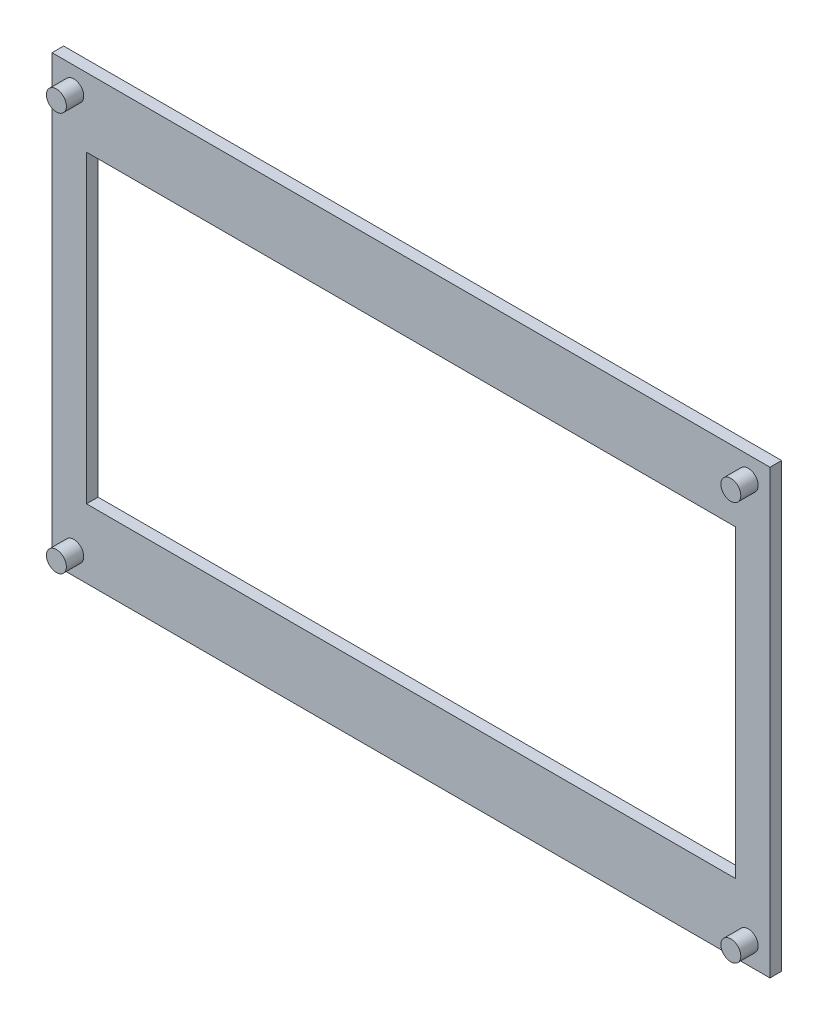
ISO-10303-21;
HEADER;
FILE_DESCRIPTION(('STEP AP214'),'2;1');
FILE_NAME('part.step','',(''),(''),'','','');
FILE_SCHEMA(('AUTOMOTIVE_DESIGN { 1 0 10303 214 1 1 1 1 }'));
ENDSEC;
DATA;
#1=APPLICATION_CONTEXT('core data for automotive mechanical design processes');
#2=APPLICATION_PROTOCOL_DEFINITION('international standard','automotive_design',2000,#1);
#3=PRODUCT_CONTEXT('',#1,'mechanical');
#4=PRODUCT('Part','Part','',(#3));
#5=PRODUCT_RELATED_PRODUCT_CATEGORY('part','',(#4));
#6=PRODUCT_DEFINITION_FORMATION('','',#4);
#7=PRODUCT_DEFINITION_CONTEXT('part definition',#1,'design');
#8=PRODUCT_DEFINITION('design','',#6,#7);
#9=PRODUCT_DEFINITION_SHAPE('','',#8);
#10=(LENGTH_UNIT() NAMED_UNIT(*) SI_UNIT(.MILLI.,.METRE.));
#11=(NAMED_UNIT(*) PLANE_ANGLE_UNIT() SI_UNIT($,.RADIAN.));
#12=(NAMED_UNIT(*) SI_UNIT($,.STERADIAN.) SOLID_ANGLE_UNIT());
#13=UNCERTAINTY_MEASURE_WITH_UNIT(LENGTH_MEASURE(1.E-05),#10,'distance_accuracy_value','');
#14=(GEOMETRIC_REPRESENTATION_CONTEXT(3) GLOBAL_UNCERTAINTY_ASSIGNED_CONTEXT((#13)) GLOBAL_UNIT_ASSIGNED_CONTEXT((#10,
#11,#12)) REPRESENTATION_CONTEXT('',''));
#15=CARTESIAN_POINT('',(0.,0.,0.));
#16=DIRECTION('',(0.,0.,1.));
#17=DIRECTION('',(1.,0.,0.));
#18=AXIS2_PLACEMENT_3D('',#15,#16,#17);
#19=CARTESIAN_POINT('',(0.,0.,-1.6));
#20=DIRECTION('',(-1.,0.,0.));
#21=DIRECTION('',(0.,0.,1.));
#22=AXIS2_PLACEMENT_3D('',#19,#20,#21);
#23=PLANE('',#22);
#24=DIRECTION('',(0.,-1.,0.));
#25=VECTOR('',#24,1.);
#26=CARTESIAN_POINT('',(0.,0.,0.));
#27=LINE('',#26,#25);
#28=CARTESIAN_POINT('',(0.,61.,0.));
#29=VERTEX_POINT('',#28);
#30=CARTESIAN_POINT('',(0.,0.,0.));
#31=VERTEX_POINT('',#30);
#32=EDGE_CURVE('E133',#29,#31,#27,.T.);
#33=ORIENTED_EDGE('',*,*,#32,.F.);
#34=DIRECTION('',(0.,0.,1.));
#35=VECTOR('',#34,1.);
#36=CARTESIAN_POINT('',(0.,61.,-1.6));
#37=LINE('',#36,#35);
#38=CARTESIAN_POINT('',(0.,61.,-1.6));
#39=VERTEX_POINT('',#38);
#40=EDGE_CURVE('E161',#39,#29,#37,.T.);
#41=ORIENTED_EDGE('',*,*,#40,.F.);
#42=DIRECTION('',(0.,-1.,0.));
#43=VECTOR('',#42,1.);
#44=CARTESIAN_POINT('',(0.,0.,-1.6));
#45=LINE('',#44,#43);
#46=CARTESIAN_POINT('',(0.,0.,-1.6));
#47=VERTEX_POINT('',#46);
#48=EDGE_CURVE('E137',#39,#47,#45,.T.);
#49=ORIENTED_EDGE('',*,*,#48,.T.);
#50=DIRECTION('',(0.,0.,1.));
#51=VECTOR('',#50,1.);
#52=CARTESIAN_POINT('',(0.,0.,-1.6));
#53=LINE('',#52,#51);
#54=EDGE_CURVE('E150',#47,#31,#53,.T.);
#55=ORIENTED_EDGE('',*,*,#54,.T.);
#56=EDGE_LOOP('',(#33,#41,#49,#55));
#57=FACE_BOUND('',#56,.T.);
#58=ADVANCED_FACE('F33',(#57),#23,.T.);
#59=CARTESIAN_POINT('',(0.,61.,-1.6));
#60=DIRECTION('',(0.,1.,0.));
#61=DIRECTION('',(0.,0.,1.));
#62=AXIS2_PLACEMENT_3D('',#59,#60,#61);
#63=PLANE('',#62);
#64=DIRECTION('',(-1.,0.,0.));
#65=VECTOR('',#64,1.);
#66=CARTESIAN_POINT('',(0.,61.,0.));
#67=LINE('',#66,#65);
#68=CARTESIAN_POINT('',(99.,61.,0.));
#69=VERTEX_POINT('',#68);
#70=EDGE_CURVE('E141',#69,#29,#67,.T.);
#71=ORIENTED_EDGE('',*,*,#70,.F.);
#72=DIRECTION('',(0.,0.,1.));
#73=VECTOR('',#72,1.);
#74=CARTESIAN_POINT('',(99.,61.,-1.6));
#75=LINE('',#74,#73);
#76=CARTESIAN_POINT('',(99.,61.,-1.6));
#77=VERTEX_POINT('',#76);
#78=EDGE_CURVE('E164',#77,#69,#75,.T.);
#79=ORIENTED_EDGE('',*,*,#78,.F.);
#80=DIRECTION('',(-1.,0.,0.));
#81=VECTOR('',#80,1.);
#82=CARTESIAN_POINT('',(0.,61.,-1.6));
#83=LINE('',#82,#81);
#84=EDGE_CURVE('E147',#77,#39,#83,.T.);
#85=ORIENTED_EDGE('',*,*,#84,.T.);
#86=ORIENTED_EDGE('',*,*,#40,.T.);
#87=EDGE_LOOP('',(#71,#79,#85,#86));
#88=FACE_BOUND('',#87,.T.);
#89=ADVANCED_FACE('F202',(#88),#63,.T.);
#90=CARTESIAN_POINT('',(99.,0.,-1.6));
#91=DIRECTION('',(1.,0.,0.));
#92=DIRECTION('',(0.,0.,-1.));
#93=AXIS2_PLACEMENT_3D('',#90,#91,#92);
#94=PLANE('',#93);
#95=DIRECTION('',(0.,1.,0.));
#96=VECTOR('',#95,1.);
#97=CARTESIAN_POINT('',(99.,0.,0.));
#98=LINE('',#97,#96);
#99=CARTESIAN_POINT('',(99.,0.,0.));
#100=VERTEX_POINT('',#99);
#101=EDGE_CURVE('E156',#100,#69,#98,.T.);
#102=ORIENTED_EDGE('',*,*,#101,.F.);
#103=DIRECTION('',(0.,0.,1.));
#104=VECTOR('',#103,1.);
#105=CARTESIAN_POINT('',(99.,0.,-1.6));
#106=LINE('',#105,#104);
#107=CARTESIAN_POINT('',(99.,0.,-1.6));
#108=VERTEX_POINT('',#107);
#109=EDGE_CURVE('E166',#108,#100,#106,.T.);
#110=ORIENTED_EDGE('',*,*,#109,.F.);
#111=DIRECTION('',(0.,1.,0.));
#112=VECTOR('',#111,1.);
#113=CARTESIAN_POINT('',(99.,0.,-1.6));
#114=LINE('',#113,#112);
#115=EDGE_CURVE('E144',#108,#77,#114,.T.);
#116=ORIENTED_EDGE('',*,*,#115,.T.);
#117=ORIENTED_EDGE('',*,*,#78,.T.);
#118=EDGE_LOOP('',(#102,#110,#116,#117));
#119=FACE_BOUND('',#118,.T.);
#120=ADVANCED_FACE('F200',(#119),#94,.T.);
#121=CARTESIAN_POINT('',(0.,0.,-1.6));
#122=DIRECTION('',(0.,-1.,0.));
#123=DIRECTION('',(0.,0.,-1.));
#124=AXIS2_PLACEMENT_3D('',#121,#122,#123);
#125=PLANE('',#124);
#126=DIRECTION('',(1.,0.,0.));
#127=VECTOR('',#126,1.);
#128=CARTESIAN_POINT('',(0.,0.,0.));
#129=LINE('',#128,#127);
#130=EDGE_CURVE('E153',#31,#100,#129,.T.);
#131=ORIENTED_EDGE('',*,*,#130,.F.);
#132=ORIENTED_EDGE('',*,*,#54,.F.);
#133=DIRECTION('',(1.,0.,0.));
#134=VECTOR('',#133,1.);
#135=CARTESIAN_POINT('',(0.,0.,-1.6));
#136=LINE('',#135,#134);
#137=EDGE_CURVE('E140',#47,#108,#136,.T.);
#138=ORIENTED_EDGE('',*,*,#137,.T.);
#139=ORIENTED_EDGE('',*,*,#109,.T.);
#140=EDGE_LOOP('',(#131,#132,#138,#139));
#141=FACE_BOUND('',#140,.T.);
#142=ADVANCED_FACE('F196',(#141),#125,.T.);
#143=CARTESIAN_POINT('',(0.,0.,-1.6));
#144=DIRECTION('',(0.,0.,-1.));
#145=DIRECTION('',(-1.,0.,0.));
#146=AXIS2_PLACEMENT_3D('',#143,#144,#145);
#147=PLANE('',#146);
#148=DIRECTION('',(0.,-1.,0.));
#149=VECTOR('',#148,1.);
#150=CARTESIAN_POINT('',(4.75000000000002,51.5,-1.6));
#151=LINE('',#150,#149);
#152=CARTESIAN_POINT('',(4.75000000000002,51.5,-1.6));
#153=VERTEX_POINT('',#152);
#154=CARTESIAN_POINT('',(4.75000000000001,9.50000000000001,-1.6));
#155=VERTEX_POINT('',#154);
#156=EDGE_CURVE('E99',#153,#155,#151,.T.);
#157=ORIENTED_EDGE('',*,*,#156,.T.);
#158=DIRECTION('',(1.,0.,0.));
#159=VECTOR('',#158,1.);
#160=CARTESIAN_POINT('',(4.75000000000001,9.50000000000001,-1.6));
#161=LINE('',#160,#159);
#162=CARTESIAN_POINT('',(94.25,9.50000000000001,-1.6));
#163=VERTEX_POINT('',#162);
#164=EDGE_CURVE('E108',#155,#163,#161,.T.);
#165=ORIENTED_EDGE('',*,*,#164,.T.);
#166=DIRECTION('',(0.,1.,0.));
#167=VECTOR('',#166,1.);
#168=CARTESIAN_POINT('',(94.25,51.5,-1.6));
#169=LINE('',#168,#167);
#170=CARTESIAN_POINT('',(94.25,51.5,-1.6));
#171=VERTEX_POINT('',#170);
#172=EDGE_CURVE('E47',#163,#171,#169,.T.);
#173=ORIENTED_EDGE('',*,*,#172,.T.);
#174=DIRECTION('',(-1.,0.,0.));
#175=VECTOR('',#174,1.);
#176=CARTESIAN_POINT('',(4.75000000000002,51.5,-1.6));
#177=LINE('',#176,#175);
#178=EDGE_CURVE('E105',#171,#153,#177,.T.);
#179=ORIENTED_EDGE('',*,*,#178,.T.);
#180=EDGE_LOOP('',(#157,#165,#173,#179));
#181=FACE_BOUND('',#180,.T.);
#182=ORIENTED_EDGE('',*,*,#48,.F.);
#183=ORIENTED_EDGE('',*,*,#84,.F.);
#184=ORIENTED_EDGE('',*,*,#115,.F.);
#185=ORIENTED_EDGE('',*,*,#137,.F.);
#186=EDGE_LOOP('',(#182,#183,#184,#185));
#187=FACE_BOUND('',#186,.T.);
#188=ADVANCED_FACE('F112',(#181,#187),#147,.T.);
#189=CARTESIAN_POINT('',(0.,0.,0.));
#190=DIRECTION('',(0.,0.,-1.));
#191=DIRECTION('',(-1.,0.,0.));
#192=AXIS2_PLACEMENT_3D('',#189,#190,#191);
#193=PLANE('',#192);
#194=CARTESIAN_POINT('',(3.,3.00000000000001,0.));
#195=DIRECTION('',(0.,0.,-1.));
#196=DIRECTION('',(-1.,0.,0.));
#197=AXIS2_PLACEMENT_3D('',#194,#195,#196);
#198=CIRCLE('',#197,1.375);
#199=CARTESIAN_POINT('',(1.625,3.00000000000001,0.));
#200=VERTEX_POINT('',#199);
#201=EDGE_CURVE('E11',#200,#200,#198,.F.);
#202=ORIENTED_EDGE('',*,*,#201,.F.);
#203=EDGE_LOOP('',(#202));
#204=FACE_BOUND('',#203,.T.);
#205=CARTESIAN_POINT('',(96.,3.,0.));
#206=DIRECTION('',(0.,0.,-1.));
#207=DIRECTION('',(-1.,0.,0.));
#208=AXIS2_PLACEMENT_3D('',#205,#206,#207);
#209=CIRCLE('',#208,1.375);
#210=CARTESIAN_POINT('',(94.625,3.,0.));
#211=VERTEX_POINT('',#210);
#212=EDGE_CURVE('E40',#211,#211,#209,.F.);
#213=ORIENTED_EDGE('',*,*,#212,.F.);
#214=EDGE_LOOP('',(#213));
#215=FACE_BOUND('',#214,.T.);
#216=CARTESIAN_POINT('',(96.,58.,0.));
#217=DIRECTION('',(0.,0.,-1.));
#218=DIRECTION('',(-1.,0.,0.));
#219=AXIS2_PLACEMENT_3D('',#216,#217,#218);
#220=CIRCLE('',#219,1.375);
#221=CARTESIAN_POINT('',(94.625,58.,0.));
#222=VERTEX_POINT('',#221);
#223=EDGE_CURVE('E171',#222,#222,#220,.F.);
#224=ORIENTED_EDGE('',*,*,#223,.F.);
#225=EDGE_LOOP('',(#224));
#226=FACE_BOUND('',#225,.T.);
#227=CARTESIAN_POINT('',(3.,58.,0.));
#228=DIRECTION('',(0.,0.,-1.));
#229=DIRECTION('',(-1.,0.,0.));
#230=AXIS2_PLACEMENT_3D('',#227,#228,#229);
#231=CIRCLE('',#230,1.375);
#232=CARTESIAN_POINT('',(1.625,58.,0.));
#233=VERTEX_POINT('',#232);
#234=EDGE_CURVE('E163',#233,#233,#231,.F.);
#235=ORIENTED_EDGE('',*,*,#234,.F.);
#236=EDGE_LOOP('',(#235));
#237=FACE_BOUND('',#236,.T.);
#238=DIRECTION('',(1.,0.,0.));
#239=VECTOR('',#238,1.);
#240=CARTESIAN_POINT('',(4.75000000000001,9.50000000000001,0.));
#241=LINE('',#240,#239);
#242=CARTESIAN_POINT('',(4.75000000000001,9.50000000000001,0.));
#243=VERTEX_POINT('',#242);
#244=CARTESIAN_POINT('',(94.25,9.50000000000001,0.));
#245=VERTEX_POINT('',#244);
#246=EDGE_CURVE('E127',#243,#245,#241,.T.);
#247=ORIENTED_EDGE('',*,*,#246,.F.);
#248=DIRECTION('',(0.,-1.,0.));
#249=VECTOR('',#248,1.);
#250=CARTESIAN_POINT('',(4.75000000000002,51.5,0.));
#251=LINE('',#250,#249);
#252=CARTESIAN_POINT('',(4.75000000000002,51.5,0.));
#253=VERTEX_POINT('',#252);
#254=EDGE_CURVE('E55',#253,#243,#251,.T.);
#255=ORIENTED_EDGE('',*,*,#254,.F.);
#256=DIRECTION('',(-1.,0.,0.));
#257=VECTOR('',#256,1.);
#258=CARTESIAN_POINT('',(4.75000000000002,51.5,0.));
#259=LINE('',#258,#257);
#260=CARTESIAN_POINT('',(94.25,51.5,0.));
#261=VERTEX_POINT('',#260);
#262=EDGE_CURVE('E115',#261,#253,#259,.T.);
#263=ORIENTED_EDGE('',*,*,#262,.F.);
#264=DIRECTION('',(0.,1.,0.));
#265=VECTOR('',#264,1.);
#266=CARTESIAN_POINT('',(94.25,51.5,0.));
#267=LINE('',#266,#265);
#268=EDGE_CURVE('E118',#245,#261,#267,.T.);
#269=ORIENTED_EDGE('',*,*,#268,.F.);
#270=EDGE_LOOP('',(#247,#255,#263,#269));
#271=FACE_BOUND('',#270,.T.);
#272=ORIENTED_EDGE('',*,*,#32,.T.);
#273=ORIENTED_EDGE('',*,*,#130,.T.);
#274=ORIENTED_EDGE('',*,*,#101,.T.);
#275=ORIENTED_EDGE('',*,*,#70,.T.);
#276=EDGE_LOOP('',(#272,#273,#274,#275));
#277=FACE_BOUND('',#276,.T.);
#278=ADVANCED_FACE('F178',(#204,#215,#226,#237,#271,#277),#193,.F.);
#279=CARTESIAN_POINT('',(4.75000000000002,51.5,-1.6));
#280=DIRECTION('',(-1.,0.,0.));
#281=DIRECTION('',(0.,-1.,0.));
#282=AXIS2_PLACEMENT_3D('',#279,#280,#281);
#283=PLANE('',#282);
#284=ORIENTED_EDGE('',*,*,#254,.T.);
#285=DIRECTION('',(0.,0.,1.));
#286=VECTOR('',#285,1.);
#287=CARTESIAN_POINT('',(4.75000000000001,9.50000000000001,-1.6));
#288=LINE('',#287,#286);
#289=EDGE_CURVE('E95',#155,#243,#288,.T.);
#290=ORIENTED_EDGE('',*,*,#289,.F.);
#291=ORIENTED_EDGE('',*,*,#156,.F.);
#292=DIRECTION('',(0.,0.,1.));
#293=VECTOR('',#292,1.);
#294=CARTESIAN_POINT('',(4.75000000000002,51.5,-1.6));
#295=LINE('',#294,#293);
#296=EDGE_CURVE('E131',#153,#253,#295,.T.);
#297=ORIENTED_EDGE('',*,*,#296,.T.);
#298=EDGE_LOOP('',(#284,#290,#291,#297));
#299=FACE_BOUND('',#298,.T.);
#300=ADVANCED_FACE('F97',(#299),#283,.F.);
#301=CARTESIAN_POINT('',(4.75000000000002,51.5,-1.6));
#302=DIRECTION('',(0.,1.,0.));
#303=DIRECTION('',(0.,0.,1.));
#304=AXIS2_PLACEMENT_3D('',#301,#302,#303);
#305=PLANE('',#304);
#306=ORIENTED_EDGE('',*,*,#262,.T.);
#307=ORIENTED_EDGE('',*,*,#296,.F.);
#308=ORIENTED_EDGE('',*,*,#178,.F.);
#309=DIRECTION('',(0.,0.,1.));
#310=VECTOR('',#309,1.);
#311=CARTESIAN_POINT('',(94.25,51.5,-1.6));
#312=LINE('',#311,#310);
#313=EDGE_CURVE('E134',#171,#261,#312,.T.);
#314=ORIENTED_EDGE('',*,*,#313,.T.);
#315=EDGE_LOOP('',(#306,#307,#308,#314));
#316=FACE_BOUND('',#315,.T.);
#317=ADVANCED_FACE('F240',(#316),#305,.F.);
#318=CARTESIAN_POINT('',(94.25,51.5,-1.6));
#319=DIRECTION('',(1.,0.,0.));
#320=DIRECTION('',(0.,1.,0.));
#321=AXIS2_PLACEMENT_3D('',#318,#319,#320);
#322=PLANE('',#321);
#323=ORIENTED_EDGE('',*,*,#268,.T.);
#324=ORIENTED_EDGE('',*,*,#313,.F.);
#325=ORIENTED_EDGE('',*,*,#172,.F.);
#326=DIRECTION('',(0.,0.,1.));
#327=VECTOR('',#326,1.);
#328=CARTESIAN_POINT('',(94.25,9.50000000000001,-1.6));
#329=LINE('',#328,#327);
#330=EDGE_CURVE('E104',#163,#245,#329,.T.);
#331=ORIENTED_EDGE('',*,*,#330,.T.);
#332=EDGE_LOOP('',(#323,#324,#325,#331));
#333=FACE_BOUND('',#332,.T.);
#334=ADVANCED_FACE('F248',(#333),#322,.F.);
#335=CARTESIAN_POINT('',(4.75000000000001,9.50000000000001,-1.6));
#336=DIRECTION('',(0.,-1.,0.));
#337=DIRECTION('',(0.,0.,-1.));
#338=AXIS2_PLACEMENT_3D('',#335,#336,#337);
#339=PLANE('',#338);
#340=ORIENTED_EDGE('',*,*,#246,.T.);
#341=ORIENTED_EDGE('',*,*,#330,.F.);
#342=ORIENTED_EDGE('',*,*,#164,.F.);
#343=ORIENTED_EDGE('',*,*,#289,.T.);
#344=EDGE_LOOP('',(#340,#341,#342,#343));
#345=FACE_BOUND('',#344,.T.);
#346=ADVANCED_FACE('F109',(#345),#339,.F.);
#347=CARTESIAN_POINT('',(3.,58.,2.4));
#348=DIRECTION('',(0.,0.,-1.));
#349=DIRECTION('',(-1.,0.,0.));
#350=AXIS2_PLACEMENT_3D('',#347,#348,#349);
#351=CYLINDRICAL_SURFACE('',#350,1.375);
#352=CARTESIAN_POINT('',(3.,58.,2.4));
#353=DIRECTION('',(0.,0.,1.));
#354=DIRECTION('',(1.,0.,0.));
#355=AXIS2_PLACEMENT_3D('',#352,#353,#354);
#356=CIRCLE('',#355,1.375);
#357=CARTESIAN_POINT('',(4.375,58.,2.4));
#358=VERTEX_POINT('',#357);
#359=EDGE_CURVE('E121',#358,#358,#356,.T.);
#360=ORIENTED_EDGE('',*,*,#359,.F.);
#361=EDGE_LOOP('',(#360));
#362=FACE_BOUND('',#361,.T.);
#363=ORIENTED_EDGE('',*,*,#234,.T.);
#364=EDGE_LOOP('',(#363));
#365=FACE_BOUND('',#364,.T.);
#366=ADVANCED_FACE('F265',(#362,#365),#351,.T.);
#367=CARTESIAN_POINT('',(3.,58.,2.4));
#368=DIRECTION('',(0.,0.,1.));
#369=DIRECTION('',(1.,0.,0.));
#370=AXIS2_PLACEMENT_3D('',#367,#368,#369);
#371=PLANE('',#370);
#372=ORIENTED_EDGE('',*,*,#359,.T.);
#373=EDGE_LOOP('',(#372));
#374=FACE_BOUND('',#373,.T.);
#375=ADVANCED_FACE('F277',(#374),#371,.T.);
#376=CARTESIAN_POINT('',(96.,58.,2.4));
#377=DIRECTION('',(0.,0.,-1.));
#378=DIRECTION('',(-1.,0.,0.));
#379=AXIS2_PLACEMENT_3D('',#376,#377,#378);
#380=CYLINDRICAL_SURFACE('',#379,1.375);
#381=CARTESIAN_POINT('',(96.,58.,2.4));
#382=DIRECTION('',(0.,0.,1.));
#383=DIRECTION('',(1.,0.,0.));
#384=AXIS2_PLACEMENT_3D('',#381,#382,#383);
#385=CIRCLE('',#384,1.375);
#386=CARTESIAN_POINT('',(97.375,58.,2.4));
#387=VERTEX_POINT('',#386);
#388=EDGE_CURVE('E356',#387,#387,#385,.T.);
#389=ORIENTED_EDGE('',*,*,#388,.F.);
#390=EDGE_LOOP('',(#389));
#391=FACE_BOUND('',#390,.T.);
#392=ORIENTED_EDGE('',*,*,#223,.T.);
#393=EDGE_LOOP('',(#392));
#394=FACE_BOUND('',#393,.T.);
#395=ADVANCED_FACE('F287',(#391,#394),#380,.T.);
#396=CARTESIAN_POINT('',(96.,58.,2.4));
#397=DIRECTION('',(0.,0.,1.));
#398=DIRECTION('',(1.,0.,0.));
#399=AXIS2_PLACEMENT_3D('',#396,#397,#398);
#400=PLANE('',#399);
#401=ORIENTED_EDGE('',*,*,#388,.T.);
#402=EDGE_LOOP('',(#401));
#403=FACE_BOUND('',#402,.T.);
#404=ADVANCED_FACE('F297',(#403),#400,.T.);
#405=CARTESIAN_POINT('',(96.,3.,2.4));
#406=DIRECTION('',(0.,0.,-1.));
#407=DIRECTION('',(-1.,0.,0.));
#408=AXIS2_PLACEMENT_3D('',#405,#406,#407);
#409=CYLINDRICAL_SURFACE('',#408,1.375);
#410=CARTESIAN_POINT('',(96.,3.,2.4));
#411=DIRECTION('',(0.,0.,1.));
#412=DIRECTION('',(1.,0.,0.));
#413=AXIS2_PLACEMENT_3D('',#410,#411,#412);
#414=CIRCLE('',#413,1.375);
#415=CARTESIAN_POINT('',(97.375,3.,2.4));
#416=VERTEX_POINT('',#415);
#417=EDGE_CURVE('E353',#416,#416,#414,.T.);
#418=ORIENTED_EDGE('',*,*,#417,.F.);
#419=EDGE_LOOP('',(#418));
#420=FACE_BOUND('',#419,.T.);
#421=ORIENTED_EDGE('',*,*,#212,.T.);
#422=EDGE_LOOP('',(#421));
#423=FACE_BOUND('',#422,.T.);
#424=ADVANCED_FACE('F176',(#420,#423),#409,.T.);
#425=CARTESIAN_POINT('',(96.,3.,2.4));
#426=DIRECTION('',(0.,0.,1.));
#427=DIRECTION('',(1.,0.,0.));
#428=AXIS2_PLACEMENT_3D('',#425,#426,#427);
#429=PLANE('',#428);
#430=ORIENTED_EDGE('',*,*,#417,.T.);
#431=EDGE_LOOP('',(#430));
#432=FACE_BOUND('',#431,.T.);
#433=ADVANCED_FACE('F316',(#432),#429,.T.);
#434=CARTESIAN_POINT('',(3.,3.00000000000001,2.4));
#435=DIRECTION('',(0.,0.,-1.));
#436=DIRECTION('',(-1.,0.,0.));
#437=AXIS2_PLACEMENT_3D('',#434,#435,#436);
#438=CYLINDRICAL_SURFACE('',#437,1.375);
#439=CARTESIAN_POINT('',(3.,3.00000000000001,2.4));
#440=DIRECTION('',(0.,0.,1.));
#441=DIRECTION('',(1.,0.,0.));
#442=AXIS2_PLACEMENT_3D('',#439,#440,#441);
#443=CIRCLE('',#442,1.375);
#444=CARTESIAN_POINT('',(4.375,3.00000000000001,2.4));
#445=VERTEX_POINT('',#444);
#446=EDGE_CURVE('E352',#445,#445,#443,.T.);
#447=ORIENTED_EDGE('',*,*,#446,.F.);
#448=EDGE_LOOP('',(#447));
#449=FACE_BOUND('',#448,.T.);
#450=ORIENTED_EDGE('',*,*,#201,.T.);
#451=EDGE_LOOP('',(#450));
#452=FACE_BOUND('',#451,.T.);
#453=ADVANCED_FACE('F326',(#449,#452),#438,.T.);
#454=CARTESIAN_POINT('',(3.,3.00000000000001,2.4));
#455=DIRECTION('',(0.,0.,1.));
#456=DIRECTION('',(1.,0.,0.));
#457=AXIS2_PLACEMENT_3D('',#454,#455,#456);
#458=PLANE('',#457);
#459=ORIENTED_EDGE('',*,*,#446,.T.);
#460=EDGE_LOOP('',(#459));
#461=FACE_BOUND('',#460,.T.);
#462=ADVANCED_FACE('F336',(#461),#458,.T.);
#463=CLOSED_SHELL('',(#58,#89,#120,#142,#188,#278,#300,#317,#334,#346,#366,#375,#395,#404,#424,
#433,#453,#462));
#464=MANIFOLD_SOLID_BREP('B2',#463);
#465=ADVANCED_BREP_SHAPE_REPRESENTATION('',(#18,#464),#14);
#466=SHAPE_DEFINITION_REPRESENTATION(#9,#465);
ENDSEC;
END-ISO-10303-21;
